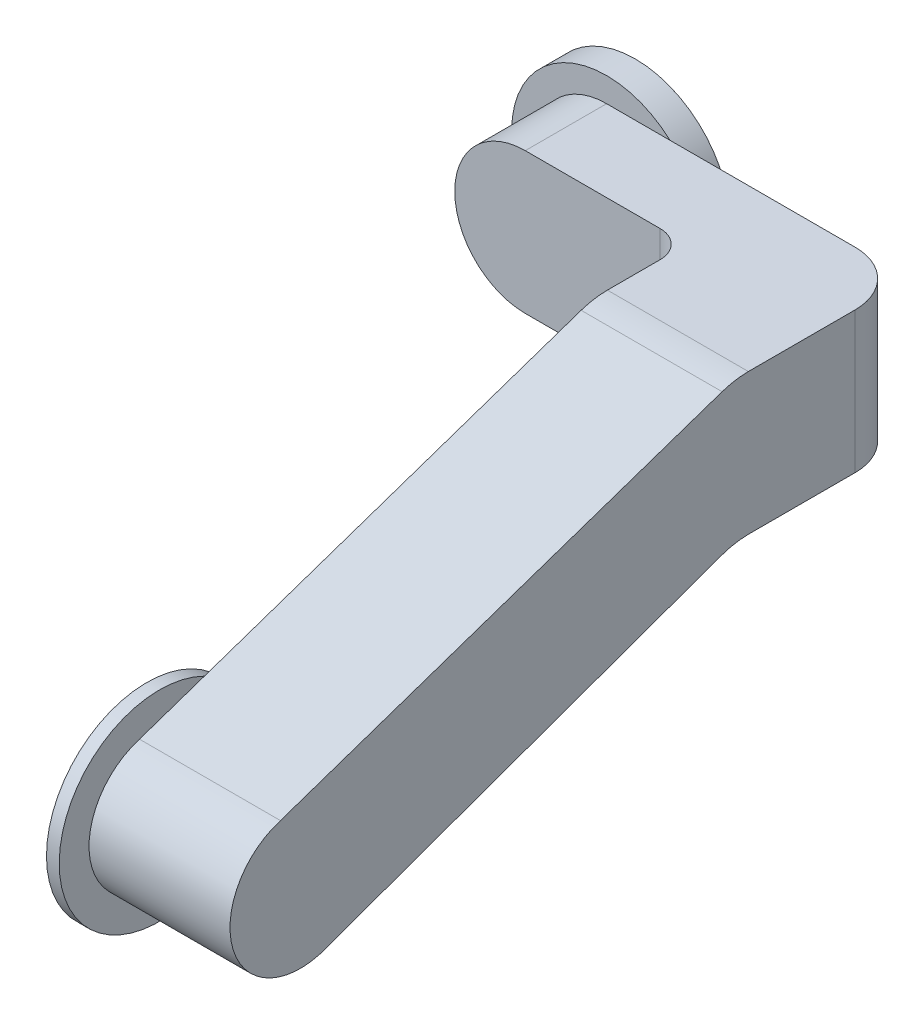
ISO-10303-21;
HEADER;
FILE_DESCRIPTION(('STEP AP214'),'2;1');
FILE_NAME('part.step','',(''),(''),'','','');
FILE_SCHEMA(('AUTOMOTIVE_DESIGN { 1 0 10303 214 1 1 1 1 }'));
ENDSEC;
DATA;
#1=APPLICATION_CONTEXT('core data for automotive mechanical design processes');
#2=APPLICATION_PROTOCOL_DEFINITION('international standard','automotive_design',2000,#1);
#3=PRODUCT_CONTEXT('',#1,'mechanical');
#4=PRODUCT('Part','Part','',(#3));
#5=PRODUCT_RELATED_PRODUCT_CATEGORY('part','',(#4));
#6=PRODUCT_DEFINITION_FORMATION('','',#4);
#7=PRODUCT_DEFINITION_CONTEXT('part definition',#1,'design');
#8=PRODUCT_DEFINITION('design','',#6,#7);
#9=PRODUCT_DEFINITION_SHAPE('','',#8);
#10=(LENGTH_UNIT() NAMED_UNIT(*) SI_UNIT(.MILLI.,.METRE.));
#11=(NAMED_UNIT(*) PLANE_ANGLE_UNIT() SI_UNIT($,.RADIAN.));
#12=(NAMED_UNIT(*) SI_UNIT($,.STERADIAN.) SOLID_ANGLE_UNIT());
#13=UNCERTAINTY_MEASURE_WITH_UNIT(LENGTH_MEASURE(1.E-05),#10,'distance_accuracy_value','');
#14=(GEOMETRIC_REPRESENTATION_CONTEXT(3) GLOBAL_UNCERTAINTY_ASSIGNED_CONTEXT((#13)) GLOBAL_UNIT_ASSIGNED_CONTEXT((#10,
#11,#12)) REPRESENTATION_CONTEXT('',''));
#15=CARTESIAN_POINT('',(0.,0.,0.));
#16=DIRECTION('',(0.,0.,1.));
#17=DIRECTION('',(1.,0.,0.));
#18=AXIS2_PLACEMENT_3D('',#15,#16,#17);
#19=CARTESIAN_POINT('',(0.,0.,51.562));
#20=DIRECTION('',(0.,0.,1.));
#21=DIRECTION('',(1.,0.,0.));
#22=AXIS2_PLACEMENT_3D('',#19,#20,#21);
#23=PLANE('',#22);
#24=DIRECTION('',(-1.,0.,0.));
#25=VECTOR('',#24,1.);
#26=CARTESIAN_POINT('',(141.859,-33.02,51.562));
#27=LINE('',#26,#25);
#28=CARTESIAN_POINT('',(63.119,-33.02,51.562));
#29=VERTEX_POINT('',#28);
#30=CARTESIAN_POINT('',(0.,-33.02,51.562));
#31=VERTEX_POINT('',#30);
#32=EDGE_CURVE('E278',#29,#31,#27,.T.);
#33=ORIENTED_EDGE('',*,*,#32,.F.);
#34=DIRECTION('',(0.,1.,0.));
#35=VECTOR('',#34,1.);
#36=CARTESIAN_POINT('',(63.119,33.02,51.562));
#37=LINE('',#36,#35);
#38=CARTESIAN_POINT('',(63.119,33.02,51.562));
#39=VERTEX_POINT('',#38);
#40=EDGE_CURVE('E322',#29,#39,#37,.T.);
#41=ORIENTED_EDGE('',*,*,#40,.T.);
#42=DIRECTION('',(-1.,0.,0.));
#43=VECTOR('',#42,1.);
#44=CARTESIAN_POINT('',(141.859,33.02,51.562));
#45=LINE('',#44,#43);
#46=CARTESIAN_POINT('',(0.,33.02,51.562));
#47=VERTEX_POINT('',#46);
#48=EDGE_CURVE('E266',#39,#47,#45,.T.);
#49=ORIENTED_EDGE('',*,*,#48,.T.);
#50=CARTESIAN_POINT('',(0.,0.,51.562));
#51=DIRECTION('',(0.,0.,1.));
#52=DIRECTION('',(1.,0.,0.));
#53=AXIS2_PLACEMENT_3D('',#50,#51,#52);
#54=CIRCLE('',#53,33.02);
#55=EDGE_CURVE('E286',#47,#31,#54,.T.);
#56=ORIENTED_EDGE('',*,*,#55,.T.);
#57=EDGE_LOOP('',(#33,#41,#49,#56));
#58=FACE_BOUND('',#57,.T.);
#59=ADVANCED_FACE('F47',(#58),#23,.T.);
#60=CARTESIAN_POINT('',(0.,0.,13.462));
#61=DIRECTION('',(0.,0.,1.));
#62=DIRECTION('',(1.,0.,0.));
#63=AXIS2_PLACEMENT_3D('',#60,#61,#62);
#64=PLANE('',#63);
#65=CARTESIAN_POINT('',(0.,0.,13.462));
#66=DIRECTION('',(0.,0.,1.));
#67=DIRECTION('',(1.,0.,0.));
#68=AXIS2_PLACEMENT_3D('',#65,#66,#67);
#69=CIRCLE('',#68,44.45);
#70=CARTESIAN_POINT('',(29.7570512652043,33.02,13.462));
#71=VERTEX_POINT('',#70);
#72=CARTESIAN_POINT('',(29.7570512652043,-33.02,13.462));
#73=VERTEX_POINT('',#72);
#74=EDGE_CURVE('E301',#71,#73,#69,.T.);
#75=ORIENTED_EDGE('',*,*,#74,.T.);
#76=DIRECTION('',(-1.,0.,0.));
#77=VECTOR('',#76,1.);
#78=CARTESIAN_POINT('',(141.859,-33.02,13.462));
#79=LINE('',#78,#77);
#80=CARTESIAN_POINT('',(0.,-33.02,13.462));
#81=VERTEX_POINT('',#80);
#82=EDGE_CURVE('E274',#73,#81,#79,.T.);
#83=ORIENTED_EDGE('',*,*,#82,.T.);
#84=CARTESIAN_POINT('',(0.,0.,13.462));
#85=DIRECTION('',(0.,0.,1.));
#86=DIRECTION('',(1.,0.,0.));
#87=AXIS2_PLACEMENT_3D('',#84,#85,#86);
#88=CIRCLE('',#87,33.02);
#89=CARTESIAN_POINT('',(0.,33.02,13.462));
#90=VERTEX_POINT('',#89);
#91=EDGE_CURVE('E285',#90,#81,#88,.T.);
#92=ORIENTED_EDGE('',*,*,#91,.F.);
#93=DIRECTION('',(-1.,0.,0.));
#94=VECTOR('',#93,1.);
#95=CARTESIAN_POINT('',(141.859,33.02,13.462));
#96=LINE('',#95,#94);
#97=EDGE_CURVE('E269',#71,#90,#96,.T.);
#98=ORIENTED_EDGE('',*,*,#97,.F.);
#99=EDGE_LOOP('',(#75,#83,#92,#98));
#100=FACE_BOUND('',#99,.T.);
#101=ADVANCED_FACE('F388',(#100),#64,.T.);
#102=CARTESIAN_POINT('',(0.,0.,13.462));
#103=DIRECTION('',(0.,0.,-1.));
#104=DIRECTION('',(-1.,0.,0.));
#105=AXIS2_PLACEMENT_3D('',#102,#103,#104);
#106=CYLINDRICAL_SURFACE('',#105,44.45);
#107=ORIENTED_EDGE('',*,*,#74,.F.);
#108=CARTESIAN_POINT('',(0.,0.,13.462));
#109=DIRECTION('',(0.,0.,1.));
#110=DIRECTION('',(0.,-1.,0.));
#111=AXIS2_PLACEMENT_3D('',#108,#109,#110);
#112=CIRCLE('',#111,44.45);
#113=EDGE_CURVE('E281',#73,#71,#112,.T.);
#114=ORIENTED_EDGE('',*,*,#113,.F.);
#115=EDGE_LOOP('',(#107,#114));
#116=FACE_BOUND('',#115,.T.);
#117=CARTESIAN_POINT('',(0.,0.,0.));
#118=DIRECTION('',(0.,0.,1.));
#119=DIRECTION('',(1.,0.,0.));
#120=AXIS2_PLACEMENT_3D('',#117,#118,#119);
#121=CIRCLE('',#120,44.45);
#122=CARTESIAN_POINT('',(44.45,0.,0.));
#123=VERTEX_POINT('',#122);
#124=EDGE_CURVE('E300',#123,#123,#121,.T.);
#125=ORIENTED_EDGE('',*,*,#124,.T.);
#126=EDGE_LOOP('',(#125));
#127=FACE_BOUND('',#126,.T.);
#128=ADVANCED_FACE('F396',(#116,#127),#106,.T.);
#129=CARTESIAN_POINT('',(0.,0.,0.));
#130=DIRECTION('',(0.,0.,1.));
#131=DIRECTION('',(1.,0.,0.));
#132=AXIS2_PLACEMENT_3D('',#129,#130,#131);
#133=PLANE('',#132);
#134=ORIENTED_EDGE('',*,*,#124,.F.);
#135=EDGE_LOOP('',(#134));
#136=FACE_BOUND('',#135,.T.);
#137=ADVANCED_FACE('F392',(#136),#133,.F.);
#138=CARTESIAN_POINT('',(0.,0.,51.562));
#139=DIRECTION('',(0.,0.,-1.));
#140=DIRECTION('',(-1.,0.,0.));
#141=AXIS2_PLACEMENT_3D('',#138,#139,#140);
#142=CYLINDRICAL_SURFACE('',#141,33.02);
#143=ORIENTED_EDGE('',*,*,#91,.T.);
#144=DIRECTION('',(0.,0.,-1.));
#145=VECTOR('',#144,1.);
#146=CARTESIAN_POINT('',(0.,-33.02,51.562));
#147=LINE('',#146,#145);
#148=EDGE_CURVE('E297',#31,#81,#147,.T.);
#149=ORIENTED_EDGE('',*,*,#148,.F.);
#150=ORIENTED_EDGE('',*,*,#55,.F.);
#151=DIRECTION('',(0.,0.,-1.));
#152=VECTOR('',#151,1.);
#153=CARTESIAN_POINT('',(0.,33.02,51.562));
#154=LINE('',#153,#152);
#155=EDGE_CURVE('E290',#47,#90,#154,.T.);
#156=ORIENTED_EDGE('',*,*,#155,.T.);
#157=EDGE_LOOP('',(#143,#149,#150,#156));
#158=FACE_BOUND('',#157,.T.);
#159=ADVANCED_FACE('F381',(#158),#142,.T.);
#160=CARTESIAN_POINT('',(141.859,33.02,13.462));
#161=DIRECTION('',(0.,0.,1.));
#162=DIRECTION('',(0.,-1.,0.));
#163=AXIS2_PLACEMENT_3D('',#160,#161,#162);
#164=PLANE('',#163);
#165=CARTESIAN_POINT('',(116.459,33.02,13.462));
#166=VERTEX_POINT('',#165);
#167=EDGE_CURVE('E271',#166,#71,#96,.T.);
#168=ORIENTED_EDGE('',*,*,#167,.F.);
#169=DIRECTION('',(0.,1.,0.));
#170=VECTOR('',#169,1.);
#171=CARTESIAN_POINT('',(116.459,-33.02,13.462));
#172=LINE('',#171,#170);
#173=CARTESIAN_POINT('',(116.459,-33.02,13.462));
#174=VERTEX_POINT('',#173);
#175=EDGE_CURVE('E315',#166,#174,#172,.F.);
#176=ORIENTED_EDGE('',*,*,#175,.T.);
#177=EDGE_CURVE('E275',#174,#73,#79,.T.);
#178=ORIENTED_EDGE('',*,*,#177,.T.);
#179=ORIENTED_EDGE('',*,*,#113,.T.);
#180=EDGE_LOOP('',(#168,#176,#178,#179));
#181=FACE_BOUND('',#180,.T.);
#182=ADVANCED_FACE('F378',(#181),#164,.F.);
#183=CARTESIAN_POINT('',(141.859,-33.02,51.562));
#184=DIRECTION('',(0.,1.,0.));
#185=DIRECTION('',(0.,0.,1.));
#186=AXIS2_PLACEMENT_3D('',#183,#184,#185);
#187=PLANE('',#186);
#188=DIRECTION('',(0.,0.,-1.));
#189=VECTOR('',#188,1.);
#190=CARTESIAN_POINT('',(141.859,-33.02,51.562));
#191=LINE('',#190,#189);
#192=CARTESIAN_POINT('',(141.859,-33.02,88.5767062435959));
#193=VERTEX_POINT('',#192);
#194=CARTESIAN_POINT('',(141.859,-33.02,38.862));
#195=VERTEX_POINT('',#194);
#196=EDGE_CURVE('E343',#193,#195,#191,.T.);
#197=ORIENTED_EDGE('',*,*,#196,.F.);
#198=DIRECTION('',(-1.,0.,0.));
#199=VECTOR('',#198,1.);
#200=CARTESIAN_POINT('',(75.819,-33.02,88.5767062435959));
#201=LINE('',#200,#199);
#202=CARTESIAN_POINT('',(75.819,-33.02,88.5767062435959));
#203=VERTEX_POINT('',#202);
#204=EDGE_CURVE('E210',#193,#203,#201,.T.);
#205=ORIENTED_EDGE('',*,*,#204,.T.);
#206=DIRECTION('',(0.,0.,-1.));
#207=VECTOR('',#206,1.);
#208=CARTESIAN_POINT('',(75.819,-33.02,95.2246));
#209=LINE('',#208,#207);
#210=CARTESIAN_POINT('',(75.819,-33.02,64.262));
#211=VERTEX_POINT('',#210);
#212=EDGE_CURVE('E205',#203,#211,#209,.T.);
#213=ORIENTED_EDGE('',*,*,#212,.T.);
#214=CARTESIAN_POINT('',(63.119,-33.02,64.262));
#215=DIRECTION('',(0.,1.,0.));
#216=DIRECTION('',(0.,0.,1.));
#217=AXIS2_PLACEMENT_3D('',#214,#215,#216);
#218=CIRCLE('',#217,12.7);
#219=EDGE_CURVE('E334',#211,#29,#218,.T.);
#220=ORIENTED_EDGE('',*,*,#219,.T.);
#221=ORIENTED_EDGE('',*,*,#32,.T.);
#222=ORIENTED_EDGE('',*,*,#148,.T.);
#223=ORIENTED_EDGE('',*,*,#82,.F.);
#224=ORIENTED_EDGE('',*,*,#177,.F.);
#225=CARTESIAN_POINT('',(116.459,-33.02,38.862));
#226=DIRECTION('',(0.,1.,0.));
#227=DIRECTION('',(0.,0.,1.));
#228=AXIS2_PLACEMENT_3D('',#225,#226,#227);
#229=CIRCLE('',#228,25.4);
#230=EDGE_CURVE('E318',#174,#195,#229,.F.);
#231=ORIENTED_EDGE('',*,*,#230,.T.);
#232=EDGE_LOOP('',(#197,#205,#213,#220,#221,#222,#223,#224,#231));
#233=FACE_BOUND('',#232,.T.);
#234=ADVANCED_FACE('F376',(#233),#187,.F.);
#235=CARTESIAN_POINT('',(141.859,33.02,51.562));
#236=DIRECTION('',(0.,-1.,0.));
#237=DIRECTION('',(0.,0.,-1.));
#238=AXIS2_PLACEMENT_3D('',#235,#236,#237);
#239=PLANE('',#238);
#240=DIRECTION('',(0.,0.,-1.));
#241=VECTOR('',#240,1.);
#242=CARTESIAN_POINT('',(75.819,33.02,95.2246));
#243=LINE('',#242,#241);
#244=CARTESIAN_POINT('',(75.819,33.02,88.9074497209391));
#245=VERTEX_POINT('',#244);
#246=CARTESIAN_POINT('',(75.819,33.02,64.262));
#247=VERTEX_POINT('',#246);
#248=EDGE_CURVE('E347',#245,#247,#243,.T.);
#249=ORIENTED_EDGE('',*,*,#248,.F.);
#250=DIRECTION('',(1.,0.,0.));
#251=VECTOR('',#250,1.);
#252=CARTESIAN_POINT('',(141.859,33.02,88.9074497209391));
#253=LINE('',#252,#251);
#254=CARTESIAN_POINT('',(141.859,33.02,88.9074497209391));
#255=VERTEX_POINT('',#254);
#256=EDGE_CURVE('E336',#245,#255,#253,.T.);
#257=ORIENTED_EDGE('',*,*,#256,.T.);
#258=DIRECTION('',(0.,0.,1.));
#259=VECTOR('',#258,1.);
#260=CARTESIAN_POINT('',(141.859,33.02,51.562));
#261=LINE('',#260,#259);
#262=CARTESIAN_POINT('',(141.859,33.02,38.862));
#263=VERTEX_POINT('',#262);
#264=EDGE_CURVE('E270',#263,#255,#261,.T.);
#265=ORIENTED_EDGE('',*,*,#264,.F.);
#266=CARTESIAN_POINT('',(116.459,33.02,38.862));
#267=DIRECTION('',(0.,-1.,0.));
#268=DIRECTION('',(0.,0.,-1.));
#269=AXIS2_PLACEMENT_3D('',#266,#267,#268);
#270=CIRCLE('',#269,25.4);
#271=EDGE_CURVE('E312',#263,#166,#270,.F.);
#272=ORIENTED_EDGE('',*,*,#271,.T.);
#273=ORIENTED_EDGE('',*,*,#167,.T.);
#274=ORIENTED_EDGE('',*,*,#97,.T.);
#275=ORIENTED_EDGE('',*,*,#155,.F.);
#276=ORIENTED_EDGE('',*,*,#48,.F.);
#277=CARTESIAN_POINT('',(63.119,33.02,64.262));
#278=DIRECTION('',(0.,-1.,0.));
#279=DIRECTION('',(0.,0.,-1.));
#280=AXIS2_PLACEMENT_3D('',#277,#278,#279);
#281=CIRCLE('',#280,12.7);
#282=EDGE_CURVE('E330',#39,#247,#281,.T.);
#283=ORIENTED_EDGE('',*,*,#282,.T.);
#284=EDGE_LOOP('',(#249,#257,#265,#272,#273,#274,#275,#276,#283));
#285=FACE_BOUND('',#284,.T.);
#286=ADVANCED_FACE('F372',(#285),#239,.F.);
#287=CARTESIAN_POINT('',(141.859,0.,0.));
#288=DIRECTION('',(1.,0.,0.));
#289=DIRECTION('',(0.,0.,-1.));
#290=AXIS2_PLACEMENT_3D('',#287,#288,#289);
#291=PLANE('',#290);
#292=ORIENTED_EDGE('',*,*,#264,.T.);
#293=CARTESIAN_POINT('',(141.859,-5.08,88.9074497209391));
#294=DIRECTION('',(1.,0.,0.));
#295=DIRECTION('',(0.,0.,-1.));
#296=AXIS2_PLACEMENT_3D('',#293,#294,#295);
#297=CIRCLE('',#296,38.1);
#298=CARTESIAN_POINT('',(141.859,30.9812247213787,101.203712226035));
#299=VERTEX_POINT('',#298);
#300=EDGE_CURVE('E194',#255,#299,#297,.T.);
#301=ORIENTED_EDGE('',*,*,#300,.T.);
#302=DIRECTION('',(0.,-0.322736548690183,0.946488837831461));
#303=VECTOR('',#302,1.);
#304=CARTESIAN_POINT('',(141.859,33.02,95.2246));
#305=LINE('',#304,#303);
#306=CARTESIAN_POINT('',(141.859,-39.5651395508729,308.094895156099));
#307=VERTEX_POINT('',#306);
#308=EDGE_CURVE('E188',#299,#307,#305,.T.);
#309=ORIENTED_EDGE('',*,*,#308,.T.);
#310=CARTESIAN_POINT('',(141.859,-71.2216,298.704));
#311=DIRECTION('',(1.,0.,0.));
#312=DIRECTION('',(0.,0.,-1.));
#313=AXIS2_PLACEMENT_3D('',#310,#311,#312);
#314=CIRCLE('',#313,33.02);
#315=CARTESIAN_POINT('',(141.859,-102.878060449127,289.313104843901));
#316=VERTEX_POINT('',#315);
#317=EDGE_CURVE('E162',#307,#316,#314,.T.);
#318=ORIENTED_EDGE('',*,*,#317,.T.);
#319=DIRECTION('',(0.,-0.338660237451934,0.940908732858294));
#320=VECTOR('',#319,1.);
#321=CARTESIAN_POINT('',(141.859,-33.02,95.2246));
#322=LINE('',#321,#320);
#323=CARTESIAN_POINT('',(141.859,-35.271377278099,101.479661290515));
#324=VERTEX_POINT('',#323);
#325=EDGE_CURVE('E184',#324,#316,#322,.T.);
#326=ORIENTED_EDGE('',*,*,#325,.F.);
#327=CARTESIAN_POINT('',(141.859,-71.12,88.5767062435959));
#328=DIRECTION('',(1.,0.,0.));
#329=DIRECTION('',(0.,0.,-1.));
#330=AXIS2_PLACEMENT_3D('',#327,#328,#329);
#331=CIRCLE('',#330,38.1);
#332=EDGE_CURVE('E12',#324,#193,#331,.F.);
#333=ORIENTED_EDGE('',*,*,#332,.T.);
#334=ORIENTED_EDGE('',*,*,#196,.T.);
#335=DIRECTION('',(0.,1.,0.));
#336=VECTOR('',#335,1.);
#337=CARTESIAN_POINT('',(141.859,33.02,38.862));
#338=LINE('',#337,#336);
#339=EDGE_CURVE('E305',#195,#263,#338,.T.);
#340=ORIENTED_EDGE('',*,*,#339,.T.);
#341=EDGE_LOOP('',(#292,#301,#309,#318,#326,#333,#334,#340));
#342=FACE_BOUND('',#341,.T.);
#343=ADVANCED_FACE('F369',(#342),#291,.T.);
#344=CARTESIAN_POINT('',(75.819,-33.02,95.2246));
#345=DIRECTION('',(-1.,0.,0.));
#346=DIRECTION('',(0.,0.,1.));
#347=AXIS2_PLACEMENT_3D('',#344,#345,#346);
#348=PLANE('',#347);
#349=DIRECTION('',(0.,-0.338660237451934,0.940908732858294));
#350=VECTOR('',#349,1.);
#351=CARTESIAN_POINT('',(75.819,-33.02,95.2246));
#352=LINE('',#351,#350);
#353=CARTESIAN_POINT('',(75.819,-35.271377278099,101.479661290515));
#354=VERTEX_POINT('',#353);
#355=CARTESIAN_POINT('',(75.819,-90.8994749103375,256.032682478589));
#356=VERTEX_POINT('',#355);
#357=EDGE_CURVE('E176',#354,#356,#352,.T.);
#358=ORIENTED_EDGE('',*,*,#357,.T.);
#359=CARTESIAN_POINT('',(75.819,-71.2216,298.704));
#360=DIRECTION('',(-1.,0.,0.));
#361=DIRECTION('',(0.,0.,1.));
#362=AXIS2_PLACEMENT_3D('',#359,#360,#361);
#363=CIRCLE('',#362,46.99);
#364=CARTESIAN_POINT('',(75.819,-29.1953972161014,277.683572326743));
#365=VERTEX_POINT('',#364);
#366=EDGE_CURVE('E168',#365,#356,#363,.T.);
#367=ORIENTED_EDGE('',*,*,#366,.F.);
#368=DIRECTION('',(0.,-0.322736548690183,0.946488837831461));
#369=VECTOR('',#368,1.);
#370=CARTESIAN_POINT('',(75.819,33.02,95.2246));
#371=LINE('',#370,#369);
#372=CARTESIAN_POINT('',(75.819,30.9812247213787,101.203712226035));
#373=VERTEX_POINT('',#372);
#374=EDGE_CURVE('E174',#373,#365,#371,.T.);
#375=ORIENTED_EDGE('',*,*,#374,.F.);
#376=CARTESIAN_POINT('',(75.819,-5.08,88.9074497209391));
#377=DIRECTION('',(-1.,0.,0.));
#378=DIRECTION('',(0.,0.,1.));
#379=AXIS2_PLACEMENT_3D('',#376,#377,#378);
#380=CIRCLE('',#379,38.1);
#381=EDGE_CURVE('E207',#373,#245,#380,.T.);
#382=ORIENTED_EDGE('',*,*,#381,.T.);
#383=ORIENTED_EDGE('',*,*,#248,.T.);
#384=DIRECTION('',(0.,1.,0.));
#385=VECTOR('',#384,1.);
#386=CARTESIAN_POINT('',(75.819,-33.02,64.262));
#387=LINE('',#386,#385);
#388=EDGE_CURVE('E326',#247,#211,#387,.F.);
#389=ORIENTED_EDGE('',*,*,#388,.T.);
#390=ORIENTED_EDGE('',*,*,#212,.F.);
#391=CARTESIAN_POINT('',(75.819,-71.12,88.5767062435959));
#392=DIRECTION('',(-1.,0.,0.));
#393=DIRECTION('',(0.,0.,1.));
#394=AXIS2_PLACEMENT_3D('',#391,#392,#393);
#395=CIRCLE('',#394,38.1);
#396=EDGE_CURVE('E58',#203,#354,#395,.F.);
#397=ORIENTED_EDGE('',*,*,#396,.T.);
#398=EDGE_LOOP('',(#358,#367,#375,#382,#383,#389,#390,#397));
#399=FACE_BOUND('',#398,.T.);
#400=ADVANCED_FACE('F173',(#399),#348,.T.);
#401=CARTESIAN_POINT('',(116.459,0.,38.862));
#402=DIRECTION('',(0.,-1.,0.));
#403=DIRECTION('',(0.,0.,-1.));
#404=AXIS2_PLACEMENT_3D('',#401,#402,#403);
#405=CYLINDRICAL_SURFACE('',#404,25.4);
#406=ORIENTED_EDGE('',*,*,#230,.F.);
#407=ORIENTED_EDGE('',*,*,#175,.F.);
#408=ORIENTED_EDGE('',*,*,#271,.F.);
#409=ORIENTED_EDGE('',*,*,#339,.F.);
#410=EDGE_LOOP('',(#406,#407,#408,#409));
#411=FACE_BOUND('',#410,.T.);
#412=ADVANCED_FACE('F368',(#411),#405,.T.);
#413=CARTESIAN_POINT('',(63.119,0.,64.262));
#414=DIRECTION('',(0.,-1.,0.));
#415=DIRECTION('',(0.,0.,-1.));
#416=AXIS2_PLACEMENT_3D('',#413,#414,#415);
#417=CYLINDRICAL_SURFACE('',#416,12.7);
#418=ORIENTED_EDGE('',*,*,#219,.F.);
#419=ORIENTED_EDGE('',*,*,#388,.F.);
#420=ORIENTED_EDGE('',*,*,#282,.F.);
#421=ORIENTED_EDGE('',*,*,#40,.F.);
#422=EDGE_LOOP('',(#418,#419,#420,#421));
#423=FACE_BOUND('',#422,.T.);
#424=ADVANCED_FACE('F406',(#423),#417,.F.);
#425=CARTESIAN_POINT('',(0.,58.6686029571663,20.0049928515292));
#426=DIRECTION('',(0.,-0.946488837831461,-0.322736548690183));
#427=DIRECTION('',(0.,0.322736548690183,-0.946488837831461));
#428=AXIS2_PLACEMENT_3D('',#425,#426,#427);
#429=PLANE('',#428);
#430=ORIENTED_EDGE('',*,*,#308,.F.);
#431=DIRECTION('',(1.,0.,0.));
#432=VECTOR('',#431,1.);
#433=CARTESIAN_POINT('',(0.,30.9812247213787,101.203712226035));
#434=LINE('',#433,#432);
#435=EDGE_CURVE('E182',#299,#373,#434,.F.);
#436=ORIENTED_EDGE('',*,*,#435,.T.);
#437=ORIENTED_EDGE('',*,*,#374,.T.);
#438=DIRECTION('',(0.,0.322736548690183,-0.946488837831461));
#439=VECTOR('',#438,1.);
#440=CARTESIAN_POINT('',(75.819,58.6686029571663,20.0049928515292));
#441=LINE('',#440,#439);
#442=CARTESIAN_POINT('',(75.819,-39.5651395508729,308.094895156099));
#443=VERTEX_POINT('',#442);
#444=EDGE_CURVE('E150',#443,#365,#441,.T.);
#445=ORIENTED_EDGE('',*,*,#444,.F.);
#446=DIRECTION('',(-1.,0.,0.));
#447=VECTOR('',#446,1.);
#448=CARTESIAN_POINT('',(141.859,-39.5651395508729,308.094895156099));
#449=LINE('',#448,#447);
#450=EDGE_CURVE('E51',#307,#443,#449,.T.);
#451=ORIENTED_EDGE('',*,*,#450,.F.);
#452=EDGE_LOOP('',(#430,#436,#437,#445,#451));
#453=FACE_BOUND('',#452,.T.);
#454=ADVANCED_FACE('F180',(#453),#429,.F.);
#455=CARTESIAN_POINT('',(0.,1.11025281693888,0.399612065958823));
#456=DIRECTION('',(0.,0.940908732858294,0.338660237451934));
#457=DIRECTION('',(0.,-0.338660237451934,0.940908732858294));
#458=AXIS2_PLACEMENT_3D('',#455,#456,#457);
#459=PLANE('',#458);
#460=ORIENTED_EDGE('',*,*,#357,.F.);
#461=DIRECTION('',(-1.,0.,0.));
#462=VECTOR('',#461,1.);
#463=CARTESIAN_POINT('',(141.859,-35.271377278099,101.479661290515));
#464=LINE('',#463,#462);
#465=EDGE_CURVE('E213',#354,#324,#464,.F.);
#466=ORIENTED_EDGE('',*,*,#465,.T.);
#467=ORIENTED_EDGE('',*,*,#325,.T.);
#468=DIRECTION('',(1.,0.,0.));
#469=VECTOR('',#468,1.);
#470=CARTESIAN_POINT('',(141.859,-102.878060449127,289.313104843901));
#471=LINE('',#470,#469);
#472=CARTESIAN_POINT('',(75.819,-102.878060449127,289.313104843901));
#473=VERTEX_POINT('',#472);
#474=EDGE_CURVE('E228',#473,#316,#471,.T.);
#475=ORIENTED_EDGE('',*,*,#474,.F.);
#476=DIRECTION('',(0.,-0.338660237451934,0.940908732858294));
#477=VECTOR('',#476,1.);
#478=CARTESIAN_POINT('',(75.819,1.11025281693888,0.399612065958823));
#479=LINE('',#478,#477);
#480=EDGE_CURVE('E163',#356,#473,#479,.T.);
#481=ORIENTED_EDGE('',*,*,#480,.F.);
#482=EDGE_LOOP('',(#460,#466,#467,#475,#481));
#483=FACE_BOUND('',#482,.T.);
#484=ADVANCED_FACE('F356',(#483),#459,.F.);
#485=CARTESIAN_POINT('',(141.859,-5.08,88.9074497209391));
#486=DIRECTION('',(1.,0.,0.));
#487=DIRECTION('',(0.,0.,-1.));
#488=AXIS2_PLACEMENT_3D('',#485,#486,#487);
#489=CYLINDRICAL_SURFACE('',#488,38.1);
#490=ORIENTED_EDGE('',*,*,#381,.F.);
#491=ORIENTED_EDGE('',*,*,#435,.F.);
#492=ORIENTED_EDGE('',*,*,#300,.F.);
#493=ORIENTED_EDGE('',*,*,#256,.F.);
#494=EDGE_LOOP('',(#490,#491,#492,#493));
#495=FACE_BOUND('',#494,.T.);
#496=ADVANCED_FACE('F365',(#495),#489,.T.);
#497=CARTESIAN_POINT('',(141.859,-71.12,88.5767062435959));
#498=DIRECTION('',(1.,0.,0.));
#499=DIRECTION('',(0.,0.,-1.));
#500=AXIS2_PLACEMENT_3D('',#497,#498,#499);
#501=CYLINDRICAL_SURFACE('',#500,38.1);
#502=ORIENTED_EDGE('',*,*,#332,.F.);
#503=ORIENTED_EDGE('',*,*,#465,.F.);
#504=ORIENTED_EDGE('',*,*,#396,.F.);
#505=ORIENTED_EDGE('',*,*,#204,.F.);
#506=EDGE_LOOP('',(#502,#503,#504,#505));
#507=FACE_BOUND('',#506,.T.);
#508=ADVANCED_FACE('F49',(#507),#501,.F.);
#509=CARTESIAN_POINT('',(75.819,-71.2216,298.704));
#510=DIRECTION('',(1.,0.,0.));
#511=DIRECTION('',(0.,0.,-1.));
#512=AXIS2_PLACEMENT_3D('',#509,#510,#511);
#513=CYLINDRICAL_SURFACE('',#512,33.02);
#514=ORIENTED_EDGE('',*,*,#317,.F.);
#515=ORIENTED_EDGE('',*,*,#450,.T.);
#516=CARTESIAN_POINT('',(75.819,-71.2216,298.704));
#517=DIRECTION('',(1.,0.,0.));
#518=DIRECTION('',(0.,0.,-1.));
#519=AXIS2_PLACEMENT_3D('',#516,#517,#518);
#520=CIRCLE('',#519,33.02);
#521=EDGE_CURVE('E156',#443,#473,#520,.T.);
#522=ORIENTED_EDGE('',*,*,#521,.T.);
#523=ORIENTED_EDGE('',*,*,#474,.T.);
#524=EDGE_LOOP('',(#514,#515,#522,#523));
#525=FACE_BOUND('',#524,.T.);
#526=ADVANCED_FACE('F234',(#525),#513,.T.);
#527=CARTESIAN_POINT('',(75.819,-71.2216,298.704));
#528=DIRECTION('',(-1.,0.,0.));
#529=DIRECTION('',(0.,0.,1.));
#530=AXIS2_PLACEMENT_3D('',#527,#528,#529);
#531=PLANE('',#530);
#532=ORIENTED_EDGE('',*,*,#521,.F.);
#533=ORIENTED_EDGE('',*,*,#444,.T.);
#534=EDGE_CURVE('E153',#356,#365,#363,.T.);
#535=ORIENTED_EDGE('',*,*,#534,.F.);
#536=ORIENTED_EDGE('',*,*,#480,.T.);
#537=EDGE_LOOP('',(#532,#533,#535,#536));
#538=FACE_BOUND('',#537,.T.);
#539=ADVANCED_FACE('F152',(#538),#531,.F.);
#540=CARTESIAN_POINT('',(69.85,-71.2216,298.704));
#541=DIRECTION('',(1.,0.,0.));
#542=DIRECTION('',(0.,0.,-1.));
#543=AXIS2_PLACEMENT_3D('',#540,#541,#542);
#544=CYLINDRICAL_SURFACE('',#543,46.99);
#545=CARTESIAN_POINT('',(69.85,-71.2216,298.704));
#546=DIRECTION('',(-1.,0.,0.));
#547=DIRECTION('',(0.,0.,1.));
#548=AXIS2_PLACEMENT_3D('',#545,#546,#547);
#549=CIRCLE('',#548,46.99);
#550=CARTESIAN_POINT('',(69.85,-71.2216,345.694));
#551=VERTEX_POINT('',#550);
#552=EDGE_CURVE('E178',#551,#551,#549,.T.);
#553=ORIENTED_EDGE('',*,*,#552,.F.);
#554=EDGE_LOOP('',(#553));
#555=FACE_BOUND('',#554,.T.);
#556=ORIENTED_EDGE('',*,*,#366,.T.);
#557=ORIENTED_EDGE('',*,*,#534,.T.);
#558=EDGE_LOOP('',(#556,#557));
#559=FACE_BOUND('',#558,.T.);
#560=ADVANCED_FACE('F167',(#555,#559),#544,.T.);
#561=CARTESIAN_POINT('',(69.85,-71.2216,298.704));
#562=DIRECTION('',(-1.,0.,0.));
#563=DIRECTION('',(0.,0.,1.));
#564=AXIS2_PLACEMENT_3D('',#561,#562,#563);
#565=PLANE('',#564);
#566=ORIENTED_EDGE('',*,*,#552,.T.);
#567=EDGE_LOOP('',(#566));
#568=FACE_BOUND('',#567,.T.);
#569=ADVANCED_FACE('F459',(#568),#565,.T.);
#570=CLOSED_SHELL('',(#59,#101,#128,#137,#159,#182,#234,#286,#343,#400,#412,#424,#454,#484,#496,
#508,#526,#539,#560,#569));
#571=MANIFOLD_SOLID_BREP('B2',#570);
#572=ADVANCED_BREP_SHAPE_REPRESENTATION('',(#18,#571),#14);
#573=SHAPE_DEFINITION_REPRESENTATION(#9,#572);
ENDSEC;
END-ISO-10303-21;
